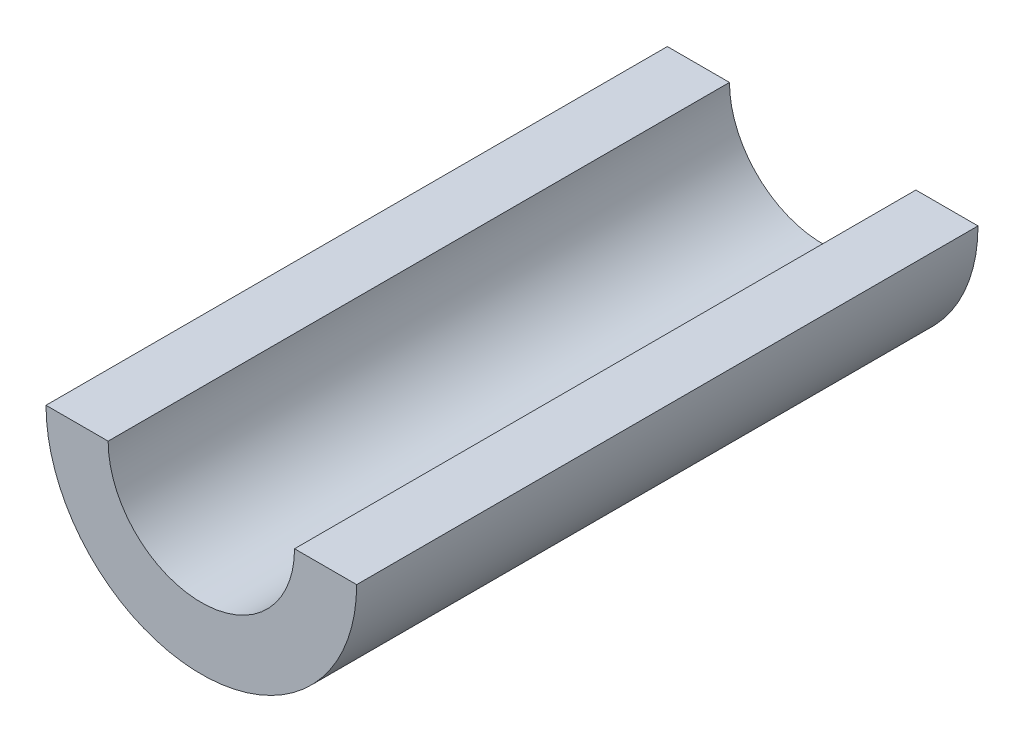
ISO-10303-21;
HEADER;
FILE_DESCRIPTION(('STEP AP214'),'2;1');
FILE_NAME('part.step','',(''),(''),'','','');
FILE_SCHEMA(('AUTOMOTIVE_DESIGN { 1 0 10303 214 1 1 1 1 }'));
ENDSEC;
DATA;
#1=APPLICATION_CONTEXT('core data for automotive mechanical design processes');
#2=APPLICATION_PROTOCOL_DEFINITION('international standard','automotive_design',2000,#1);
#3=PRODUCT_CONTEXT('',#1,'mechanical');
#4=PRODUCT('Part','Part','',(#3));
#5=PRODUCT_RELATED_PRODUCT_CATEGORY('part','',(#4));
#6=PRODUCT_DEFINITION_FORMATION('','',#4);
#7=PRODUCT_DEFINITION_CONTEXT('part definition',#1,'design');
#8=PRODUCT_DEFINITION('design','',#6,#7);
#9=PRODUCT_DEFINITION_SHAPE('','',#8);
#10=(LENGTH_UNIT() NAMED_UNIT(*) SI_UNIT(.MILLI.,.METRE.));
#11=(NAMED_UNIT(*) PLANE_ANGLE_UNIT() SI_UNIT($,.RADIAN.));
#12=(NAMED_UNIT(*) SI_UNIT($,.STERADIAN.) SOLID_ANGLE_UNIT());
#13=UNCERTAINTY_MEASURE_WITH_UNIT(LENGTH_MEASURE(1.E-05),#10,'distance_accuracy_value','');
#14=(GEOMETRIC_REPRESENTATION_CONTEXT(3) GLOBAL_UNCERTAINTY_ASSIGNED_CONTEXT((#13)) GLOBAL_UNIT_ASSIGNED_CONTEXT((#10,
#11,#12)) REPRESENTATION_CONTEXT('',''));
#15=CARTESIAN_POINT('',(0.,0.,0.));
#16=DIRECTION('',(0.,0.,1.));
#17=DIRECTION('',(1.,0.,0.));
#18=AXIS2_PLACEMENT_3D('',#15,#16,#17);
#19=CARTESIAN_POINT('',(0.,0.,40.));
#20=DIRECTION('',(0.,0.,-1.));
#21=DIRECTION('',(-1.,0.,0.));
#22=AXIS2_PLACEMENT_3D('',#19,#20,#21);
#23=CYLINDRICAL_SURFACE('',#22,6.);
#24=CARTESIAN_POINT('',(0.,0.,0.));
#25=DIRECTION('',(0.,0.,-1.));
#26=DIRECTION('',(-1.,0.,0.));
#27=AXIS2_PLACEMENT_3D('',#24,#25,#26);
#28=CIRCLE('',#27,6.);
#29=CARTESIAN_POINT('',(6.,0.,0.));
#30=VERTEX_POINT('',#29);
#31=CARTESIAN_POINT('',(-6.,0.,0.));
#32=VERTEX_POINT('',#31);
#33=EDGE_CURVE('E96',#30,#32,#28,.T.);
#34=ORIENTED_EDGE('',*,*,#33,.T.);
#35=DIRECTION('',(0.,0.,-1.));
#36=VECTOR('',#35,1.);
#37=CARTESIAN_POINT('',(-6.,0.,40.));
#38=LINE('',#37,#36);
#39=CARTESIAN_POINT('',(-6.,0.,40.));
#40=VERTEX_POINT('',#39);
#41=EDGE_CURVE('E11',#40,#32,#38,.T.);
#42=ORIENTED_EDGE('',*,*,#41,.F.);
#43=CARTESIAN_POINT('',(0.,0.,40.));
#44=DIRECTION('',(0.,0.,-1.));
#45=DIRECTION('',(-1.,0.,0.));
#46=AXIS2_PLACEMENT_3D('',#43,#44,#45);
#47=CIRCLE('',#46,6.);
#48=CARTESIAN_POINT('',(6.,0.,40.));
#49=VERTEX_POINT('',#48);
#50=EDGE_CURVE('E84',#49,#40,#47,.T.);
#51=ORIENTED_EDGE('',*,*,#50,.F.);
#52=DIRECTION('',(0.,0.,-1.));
#53=VECTOR('',#52,1.);
#54=CARTESIAN_POINT('',(6.,0.,40.));
#55=LINE('',#54,#53);
#56=EDGE_CURVE('E92',#49,#30,#55,.T.);
#57=ORIENTED_EDGE('',*,*,#56,.T.);
#58=EDGE_LOOP('',(#34,#42,#51,#57));
#59=FACE_BOUND('',#58,.T.);
#60=ADVANCED_FACE('F33',(#59),#23,.F.);
#61=CARTESIAN_POINT('',(-10.,0.,40.));
#62=DIRECTION('',(0.,-1.,0.));
#63=DIRECTION('',(0.,0.,-1.));
#64=AXIS2_PLACEMENT_3D('',#61,#62,#63);
#65=PLANE('',#64);
#66=DIRECTION('',(-1.,0.,0.));
#67=VECTOR('',#66,1.);
#68=CARTESIAN_POINT('',(-10.,0.,0.));
#69=LINE('',#68,#67);
#70=CARTESIAN_POINT('',(-10.,0.,0.));
#71=VERTEX_POINT('',#70);
#72=EDGE_CURVE('E88',#32,#71,#69,.T.);
#73=ORIENTED_EDGE('',*,*,#72,.T.);
#74=DIRECTION('',(0.,0.,-1.));
#75=VECTOR('',#74,1.);
#76=CARTESIAN_POINT('',(-10.,0.,40.));
#77=LINE('',#76,#75);
#78=CARTESIAN_POINT('',(-10.,0.,40.));
#79=VERTEX_POINT('',#78);
#80=EDGE_CURVE('E41',#79,#71,#77,.T.);
#81=ORIENTED_EDGE('',*,*,#80,.F.);
#82=DIRECTION('',(-1.,0.,0.));
#83=VECTOR('',#82,1.);
#84=CARTESIAN_POINT('',(-10.,0.,40.));
#85=LINE('',#84,#83);
#86=EDGE_CURVE('E79',#40,#79,#85,.T.);
#87=ORIENTED_EDGE('',*,*,#86,.F.);
#88=ORIENTED_EDGE('',*,*,#41,.T.);
#89=EDGE_LOOP('',(#73,#81,#87,#88));
#90=FACE_BOUND('',#89,.T.);
#91=ADVANCED_FACE('F87',(#90),#65,.F.);
#92=CARTESIAN_POINT('',(0.,0.,40.));
#93=DIRECTION('',(0.,0.,-1.));
#94=DIRECTION('',(-1.,0.,0.));
#95=AXIS2_PLACEMENT_3D('',#92,#93,#94);
#96=CYLINDRICAL_SURFACE('',#95,10.);
#97=CARTESIAN_POINT('',(0.,0.,0.));
#98=DIRECTION('',(0.,0.,1.));
#99=DIRECTION('',(-1.,0.,0.));
#100=AXIS2_PLACEMENT_3D('',#97,#98,#99);
#101=CIRCLE('',#100,10.);
#102=CARTESIAN_POINT('',(10.,0.,0.));
#103=VERTEX_POINT('',#102);
#104=EDGE_CURVE('E66',#71,#103,#101,.T.);
#105=ORIENTED_EDGE('',*,*,#104,.T.);
#106=DIRECTION('',(0.,0.,-1.));
#107=VECTOR('',#106,1.);
#108=CARTESIAN_POINT('',(10.,0.,40.));
#109=LINE('',#108,#107);
#110=CARTESIAN_POINT('',(10.,0.,40.));
#111=VERTEX_POINT('',#110);
#112=EDGE_CURVE('E89',#111,#103,#109,.T.);
#113=ORIENTED_EDGE('',*,*,#112,.F.);
#114=CARTESIAN_POINT('',(0.,0.,40.));
#115=DIRECTION('',(0.,0.,1.));
#116=DIRECTION('',(-1.,0.,0.));
#117=AXIS2_PLACEMENT_3D('',#114,#115,#116);
#118=CIRCLE('',#117,10.);
#119=EDGE_CURVE('E82',#79,#111,#118,.T.);
#120=ORIENTED_EDGE('',*,*,#119,.F.);
#121=ORIENTED_EDGE('',*,*,#80,.T.);
#122=EDGE_LOOP('',(#105,#113,#120,#121));
#123=FACE_BOUND('',#122,.T.);
#124=ADVANCED_FACE('F90',(#123),#96,.T.);
#125=CARTESIAN_POINT('',(6.,0.,40.));
#126=DIRECTION('',(0.,-1.,0.));
#127=DIRECTION('',(0.,0.,-1.));
#128=AXIS2_PLACEMENT_3D('',#125,#126,#127);
#129=PLANE('',#128);
#130=DIRECTION('',(-1.,0.,0.));
#131=VECTOR('',#130,1.);
#132=CARTESIAN_POINT('',(6.,0.,0.));
#133=LINE('',#132,#131);
#134=EDGE_CURVE('E72',#103,#30,#133,.T.);
#135=ORIENTED_EDGE('',*,*,#134,.T.);
#136=ORIENTED_EDGE('',*,*,#56,.F.);
#137=DIRECTION('',(-1.,0.,0.));
#138=VECTOR('',#137,1.);
#139=CARTESIAN_POINT('',(6.,0.,40.));
#140=LINE('',#139,#138);
#141=EDGE_CURVE('E49',#111,#49,#140,.T.);
#142=ORIENTED_EDGE('',*,*,#141,.F.);
#143=ORIENTED_EDGE('',*,*,#112,.T.);
#144=EDGE_LOOP('',(#135,#136,#142,#143));
#145=FACE_BOUND('',#144,.T.);
#146=ADVANCED_FACE('F103',(#145),#129,.F.);
#147=CARTESIAN_POINT('',(0.,0.,40.));
#148=DIRECTION('',(0.,0.,-1.));
#149=DIRECTION('',(-1.,0.,0.));
#150=AXIS2_PLACEMENT_3D('',#147,#148,#149);
#151=PLANE('',#150);
#152=ORIENTED_EDGE('',*,*,#50,.T.);
#153=ORIENTED_EDGE('',*,*,#86,.T.);
#154=ORIENTED_EDGE('',*,*,#119,.T.);
#155=ORIENTED_EDGE('',*,*,#141,.T.);
#156=EDGE_LOOP('',(#152,#153,#154,#155));
#157=FACE_BOUND('',#156,.T.);
#158=ADVANCED_FACE('F80',(#157),#151,.F.);
#159=CARTESIAN_POINT('',(0.,0.,0.));
#160=DIRECTION('',(0.,0.,-1.));
#161=DIRECTION('',(-1.,0.,0.));
#162=AXIS2_PLACEMENT_3D('',#159,#160,#161);
#163=PLANE('',#162);
#164=ORIENTED_EDGE('',*,*,#33,.F.);
#165=ORIENTED_EDGE('',*,*,#134,.F.);
#166=ORIENTED_EDGE('',*,*,#104,.F.);
#167=ORIENTED_EDGE('',*,*,#72,.F.);
#168=EDGE_LOOP('',(#164,#165,#166,#167));
#169=FACE_BOUND('',#168,.T.);
#170=ADVANCED_FACE('F106',(#169),#163,.T.);
#171=CLOSED_SHELL('',(#60,#91,#124,#146,#158,#170));
#172=MANIFOLD_SOLID_BREP('B2',#171);
#173=ADVANCED_BREP_SHAPE_REPRESENTATION('',(#18,#172),#14);
#174=SHAPE_DEFINITION_REPRESENTATION(#9,#173);
ENDSEC;
END-ISO-10303-21;
